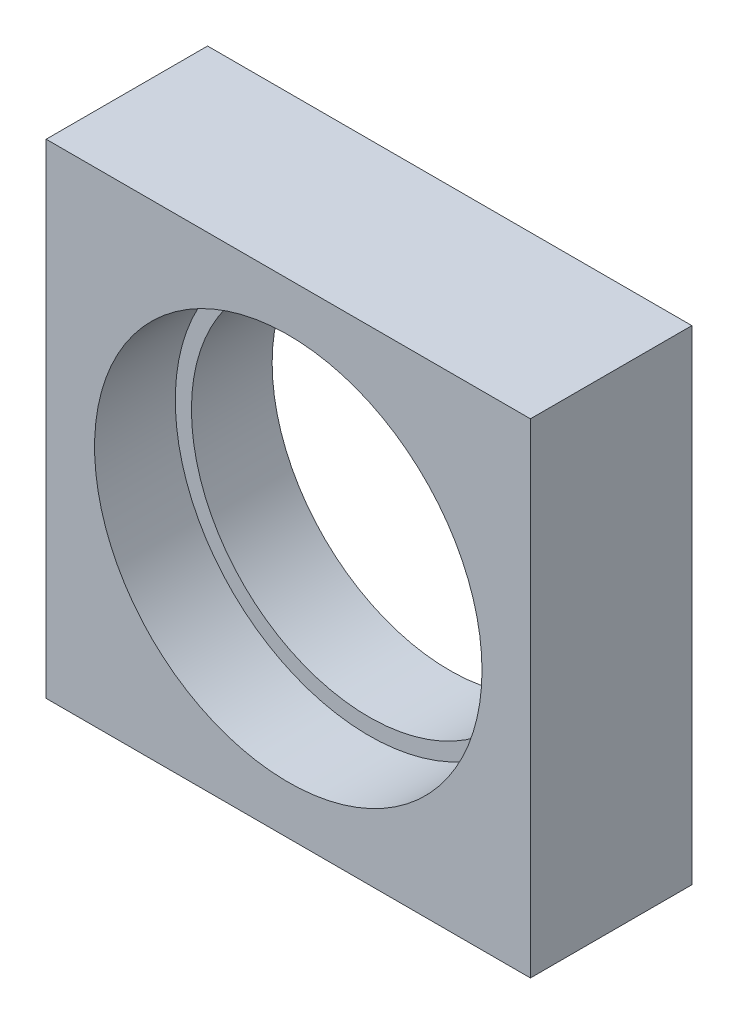
ISO-10303-21;
HEADER;
FILE_DESCRIPTION(('STEP AP214'),'2;1');
FILE_NAME('part.step','',(''),(''),'','','');
FILE_SCHEMA(('AUTOMOTIVE_DESIGN { 1 0 10303 214 1 1 1 1 }'));
ENDSEC;
DATA;
#1=APPLICATION_CONTEXT('core data for automotive mechanical design processes');
#2=APPLICATION_PROTOCOL_DEFINITION('international standard','automotive_design',2000,#1);
#3=PRODUCT_CONTEXT('',#1,'mechanical');
#4=PRODUCT('Part','Part','',(#3));
#5=PRODUCT_RELATED_PRODUCT_CATEGORY('part','',(#4));
#6=PRODUCT_DEFINITION_FORMATION('','',#4);
#7=PRODUCT_DEFINITION_CONTEXT('part definition',#1,'design');
#8=PRODUCT_DEFINITION('design','',#6,#7);
#9=PRODUCT_DEFINITION_SHAPE('','',#8);
#10=(LENGTH_UNIT() NAMED_UNIT(*) SI_UNIT(.MILLI.,.METRE.));
#11=(NAMED_UNIT(*) PLANE_ANGLE_UNIT() SI_UNIT($,.RADIAN.));
#12=(NAMED_UNIT(*) SI_UNIT($,.STERADIAN.) SOLID_ANGLE_UNIT());
#13=UNCERTAINTY_MEASURE_WITH_UNIT(LENGTH_MEASURE(1.E-05),#10,'distance_accuracy_value','');
#14=(GEOMETRIC_REPRESENTATION_CONTEXT(3) GLOBAL_UNCERTAINTY_ASSIGNED_CONTEXT((#13)) GLOBAL_UNIT_ASSIGNED_CONTEXT((#10,
#11,#12)) REPRESENTATION_CONTEXT('',''));
#15=CARTESIAN_POINT('',(0.,0.,0.));
#16=DIRECTION('',(0.,0.,1.));
#17=DIRECTION('',(1.,0.,0.));
#18=AXIS2_PLACEMENT_3D('',#15,#16,#17);
#19=CARTESIAN_POINT('',(-8.03689124095508,36.1836054830851,-30.426406871193));
#20=DIRECTION('',(-1.,0.,0.));
#21=DIRECTION('',(0.,-1.,0.));
#22=AXIS2_PLACEMENT_3D('',#19,#20,#21);
#23=PLANE('',#22);
#24=DIRECTION('',(0.,1.,0.));
#25=VECTOR('',#24,1.);
#26=CARTESIAN_POINT('',(-8.03689124095508,36.1836054830851,11.9999999999999));
#27=LINE('',#26,#25);
#28=CARTESIAN_POINT('',(-8.03689124095507,6.18360548308507,11.9999999999999));
#29=VERTEX_POINT('',#28);
#30=CARTESIAN_POINT('',(-8.03689124095508,36.1836054830851,11.9999999999999));
#31=VERTEX_POINT('',#30);
#32=EDGE_CURVE('E50',#29,#31,#27,.T.);
#33=ORIENTED_EDGE('',*,*,#32,.F.);
#34=DIRECTION('',(0.,0.,1.));
#35=VECTOR('',#34,1.);
#36=CARTESIAN_POINT('',(-8.03689124095507,6.18360548308507,-30.426406871193));
#37=LINE('',#36,#35);
#38=CARTESIAN_POINT('',(-8.03689124095507,6.18360548308507,21.9999999999999));
#39=VERTEX_POINT('',#38);
#40=EDGE_CURVE('E78',#29,#39,#37,.T.);
#41=ORIENTED_EDGE('',*,*,#40,.T.);
#42=DIRECTION('',(0.,-1.,0.));
#43=VECTOR('',#42,1.);
#44=CARTESIAN_POINT('',(-8.03689124095508,36.1836054830851,21.9999999999999));
#45=LINE('',#44,#43);
#46=CARTESIAN_POINT('',(-8.03689124095508,36.1836054830851,21.9999999999999));
#47=VERTEX_POINT('',#46);
#48=EDGE_CURVE('E82',#47,#39,#45,.T.);
#49=ORIENTED_EDGE('',*,*,#48,.F.);
#50=DIRECTION('',(0.,0.,1.));
#51=VECTOR('',#50,1.);
#52=CARTESIAN_POINT('',(-8.03689124095508,36.1836054830851,-30.426406871193));
#53=LINE('',#52,#51);
#54=EDGE_CURVE('E115',#31,#47,#53,.T.);
#55=ORIENTED_EDGE('',*,*,#54,.F.);
#56=EDGE_LOOP('',(#33,#41,#49,#55));
#57=FACE_BOUND('',#56,.T.);
#58=ADVANCED_FACE('F41',(#57),#23,.T.);
#59=CARTESIAN_POINT('',(-8.03689124095508,36.1836054830851,-30.426406871193));
#60=DIRECTION('',(0.,1.,0.));
#61=DIRECTION('',(0.,0.,1.));
#62=AXIS2_PLACEMENT_3D('',#59,#60,#61);
#63=PLANE('',#62);
#64=DIRECTION('',(1.,0.,0.));
#65=VECTOR('',#64,1.);
#66=CARTESIAN_POINT('',(-8.03689124095508,36.1836054830851,11.9999999999999));
#67=LINE('',#66,#65);
#68=CARTESIAN_POINT('',(21.9631087590449,36.1836054830851,11.9999999999999));
#69=VERTEX_POINT('',#68);
#70=EDGE_CURVE('E56',#31,#69,#67,.T.);
#71=ORIENTED_EDGE('',*,*,#70,.F.);
#72=ORIENTED_EDGE('',*,*,#54,.T.);
#73=DIRECTION('',(-1.,0.,0.));
#74=VECTOR('',#73,1.);
#75=CARTESIAN_POINT('',(-8.03689124095508,36.1836054830851,21.9999999999999));
#76=LINE('',#75,#74);
#77=CARTESIAN_POINT('',(21.9631087590449,36.1836054830851,21.9999999999999));
#78=VERTEX_POINT('',#77);
#79=EDGE_CURVE('E88',#78,#47,#76,.T.);
#80=ORIENTED_EDGE('',*,*,#79,.F.);
#81=DIRECTION('',(0.,0.,1.));
#82=VECTOR('',#81,1.);
#83=CARTESIAN_POINT('',(21.9631087590449,36.1836054830851,-30.426406871193));
#84=LINE('',#83,#82);
#85=EDGE_CURVE('E119',#69,#78,#84,.T.);
#86=ORIENTED_EDGE('',*,*,#85,.F.);
#87=EDGE_LOOP('',(#71,#72,#80,#86));
#88=FACE_BOUND('',#87,.T.);
#89=ADVANCED_FACE('F130',(#88),#63,.T.);
#90=CARTESIAN_POINT('',(21.9631087590449,36.1836054830851,-30.426406871193));
#91=DIRECTION('',(1.,0.,0.));
#92=DIRECTION('',(0.,1.,0.));
#93=AXIS2_PLACEMENT_3D('',#90,#91,#92);
#94=PLANE('',#93);
#95=DIRECTION('',(0.,-1.,0.));
#96=VECTOR('',#95,1.);
#97=CARTESIAN_POINT('',(21.9631087590449,36.1836054830851,11.9999999999999));
#98=LINE('',#97,#96);
#99=CARTESIAN_POINT('',(21.9631087590449,6.18360548308506,11.9999999999999));
#100=VERTEX_POINT('',#99);
#101=EDGE_CURVE('E118',#69,#100,#98,.T.);
#102=ORIENTED_EDGE('',*,*,#101,.F.);
#103=ORIENTED_EDGE('',*,*,#85,.T.);
#104=DIRECTION('',(0.,1.,0.));
#105=VECTOR('',#104,1.);
#106=CARTESIAN_POINT('',(21.9631087590449,36.1836054830851,21.9999999999999));
#107=LINE('',#106,#105);
#108=CARTESIAN_POINT('',(21.9631087590449,6.18360548308506,21.9999999999999));
#109=VERTEX_POINT('',#108);
#110=EDGE_CURVE('E97',#109,#78,#107,.T.);
#111=ORIENTED_EDGE('',*,*,#110,.F.);
#112=DIRECTION('',(0.,0.,1.));
#113=VECTOR('',#112,1.);
#114=CARTESIAN_POINT('',(21.9631087590449,6.18360548308506,-30.426406871193));
#115=LINE('',#114,#113);
#116=EDGE_CURVE('E87',#100,#109,#115,.T.);
#117=ORIENTED_EDGE('',*,*,#116,.F.);
#118=EDGE_LOOP('',(#102,#103,#111,#117));
#119=FACE_BOUND('',#118,.T.);
#120=ADVANCED_FACE('F132',(#119),#94,.T.);
#121=CARTESIAN_POINT('',(-8.03689124095507,6.18360548308507,-30.426406871193));
#122=DIRECTION('',(0.,-1.,0.));
#123=DIRECTION('',(1.,0.,0.));
#124=AXIS2_PLACEMENT_3D('',#121,#122,#123);
#125=PLANE('',#124);
#126=DIRECTION('',(-1.,0.,0.));
#127=VECTOR('',#126,1.);
#128=CARTESIAN_POINT('',(-8.03689124095507,6.18360548308507,11.9999999999999));
#129=LINE('',#128,#127);
#130=EDGE_CURVE('E11',#100,#29,#129,.T.);
#131=ORIENTED_EDGE('',*,*,#130,.F.);
#132=ORIENTED_EDGE('',*,*,#116,.T.);
#133=DIRECTION('',(1.,0.,0.));
#134=VECTOR('',#133,1.);
#135=CARTESIAN_POINT('',(-8.03689124095507,6.18360548308507,21.9999999999999));
#136=LINE('',#135,#134);
#137=EDGE_CURVE('E90',#39,#109,#136,.T.);
#138=ORIENTED_EDGE('',*,*,#137,.F.);
#139=ORIENTED_EDGE('',*,*,#40,.F.);
#140=EDGE_LOOP('',(#131,#132,#138,#139));
#141=FACE_BOUND('',#140,.T.);
#142=ADVANCED_FACE('F91',(#141),#125,.T.);
#143=CARTESIAN_POINT('',(0.,0.,21.9999999999999));
#144=DIRECTION('',(0.,0.,1.));
#145=DIRECTION('',(1.,0.,0.));
#146=AXIS2_PLACEMENT_3D('',#143,#144,#145);
#147=PLANE('',#146);
#148=CARTESIAN_POINT('',(6.96310875904493,21.1836054830851,21.9999999999999));
#149=DIRECTION('',(0.,0.,1.));
#150=DIRECTION('',(1.,0.,0.));
#151=AXIS2_PLACEMENT_3D('',#148,#149,#150);
#152=CIRCLE('',#151,12.);
#153=CARTESIAN_POINT('',(18.9631087590449,21.1836054830851,21.9999999999999));
#154=VERTEX_POINT('',#153);
#155=EDGE_CURVE('E102',#154,#154,#152,.T.);
#156=ORIENTED_EDGE('',*,*,#155,.F.);
#157=EDGE_LOOP('',(#156));
#158=FACE_BOUND('',#157,.T.);
#159=ORIENTED_EDGE('',*,*,#48,.T.);
#160=ORIENTED_EDGE('',*,*,#137,.T.);
#161=ORIENTED_EDGE('',*,*,#110,.T.);
#162=ORIENTED_EDGE('',*,*,#79,.T.);
#163=EDGE_LOOP('',(#159,#160,#161,#162));
#164=FACE_BOUND('',#163,.T.);
#165=ADVANCED_FACE('F99',(#158,#164),#147,.T.);
#166=CARTESIAN_POINT('',(6.96310875904493,21.1836054830851,11.9999999999999));
#167=DIRECTION('',(0.,0.,1.));
#168=DIRECTION('',(1.,0.,0.));
#169=AXIS2_PLACEMENT_3D('',#166,#167,#168);
#170=PLANE('',#169);
#171=CARTESIAN_POINT('',(6.96310875904493,21.1836054830851,11.9999999999999));
#172=DIRECTION('',(0.,0.,1.));
#173=DIRECTION('',(1.,0.,0.));
#174=AXIS2_PLACEMENT_3D('',#171,#172,#173);
#175=CIRCLE('',#174,11.);
#176=CARTESIAN_POINT('',(-4.03689124095507,21.1836054830851,11.9999999999999));
#177=VERTEX_POINT('',#176);
#178=EDGE_CURVE('E106',#177,#177,#175,.T.);
#179=ORIENTED_EDGE('',*,*,#178,.T.);
#180=EDGE_LOOP('',(#179));
#181=FACE_BOUND('',#180,.T.);
#182=ORIENTED_EDGE('',*,*,#32,.T.);
#183=ORIENTED_EDGE('',*,*,#70,.T.);
#184=ORIENTED_EDGE('',*,*,#101,.T.);
#185=ORIENTED_EDGE('',*,*,#130,.T.);
#186=EDGE_LOOP('',(#182,#183,#184,#185));
#187=FACE_BOUND('',#186,.T.);
#188=ADVANCED_FACE('F127',(#181,#187),#170,.F.);
#189=CARTESIAN_POINT('',(6.96310875904493,21.1836054830851,11.9999999999999));
#190=DIRECTION('',(0.,0.,-1.));
#191=DIRECTION('',(-1.,0.,0.));
#192=AXIS2_PLACEMENT_3D('',#189,#190,#191);
#193=CYLINDRICAL_SURFACE('',#192,12.);
#194=CARTESIAN_POINT('',(6.96310875904493,21.1836054830851,16.9999999999998));
#195=DIRECTION('',(0.,0.,1.));
#196=DIRECTION('',(1.,0.,0.));
#197=AXIS2_PLACEMENT_3D('',#194,#195,#196);
#198=CIRCLE('',#197,12.);
#199=CARTESIAN_POINT('',(18.9631087590449,21.1836054830851,16.9999999999998));
#200=VERTEX_POINT('',#199);
#201=EDGE_CURVE('E228',#200,#200,#198,.F.);
#202=ORIENTED_EDGE('',*,*,#201,.T.);
#203=EDGE_LOOP('',(#202));
#204=FACE_BOUND('',#203,.T.);
#205=ORIENTED_EDGE('',*,*,#155,.T.);
#206=EDGE_LOOP('',(#205));
#207=FACE_BOUND('',#206,.T.);
#208=ADVANCED_FACE('F166',(#204,#207),#193,.F.);
#209=CARTESIAN_POINT('',(6.96310875904493,21.1836054830851,55.9411254969541));
#210=DIRECTION('',(0.,0.,-1.));
#211=DIRECTION('',(-1.,0.,0.));
#212=AXIS2_PLACEMENT_3D('',#209,#210,#211);
#213=CYLINDRICAL_SURFACE('',#212,11.);
#214=CARTESIAN_POINT('',(6.96310875904493,21.1836054830851,16.9999999999998));
#215=DIRECTION('',(0.,0.,1.));
#216=DIRECTION('',(1.,0.,0.));
#217=AXIS2_PLACEMENT_3D('',#214,#215,#216);
#218=CIRCLE('',#217,11.);
#219=CARTESIAN_POINT('',(-4.03689124095507,21.1836054830851,16.9999999999998));
#220=VERTEX_POINT('',#219);
#221=EDGE_CURVE('E224',#220,#220,#218,.F.);
#222=CARTESIAN_POINT('',(-4.03689124095507,21.1836054830851,16.9999999999998));
#223=CARTESIAN_POINT('',(-4.03689124095507,21.1836054830851,16.9479166666665));
#224=CARTESIAN_POINT('',(-4.03689124095507,21.1836054830851,16.8958333333332));
#225=CARTESIAN_POINT('',(-4.03689124095507,21.1836054830851,16.7916666666665));
#226=CARTESIAN_POINT('',(-4.03689124095507,21.1836054830851,16.7395833333332));
#227=CARTESIAN_POINT('',(-4.03689124095507,21.1836054830851,16.6354166666665));
#228=CARTESIAN_POINT('',(-4.03689124095507,21.1836054830851,16.5833333333332));
#229=CARTESIAN_POINT('',(-4.03689124095507,21.1836054830851,16.4791666666665));
#230=CARTESIAN_POINT('',(-4.03689124095507,21.1836054830851,16.4270833333332));
#231=CARTESIAN_POINT('',(-4.03689124095507,21.1836054830851,16.3229166666665));
#232=CARTESIAN_POINT('',(-4.03689124095507,21.1836054830851,16.2708333333332));
#233=CARTESIAN_POINT('',(-4.03689124095507,21.1836054830851,16.1666666666665));
#234=CARTESIAN_POINT('',(-4.03689124095507,21.1836054830851,16.1145833333332));
#235=CARTESIAN_POINT('',(-4.03689124095507,21.1836054830851,16.0104166666665));
#236=CARTESIAN_POINT('',(-4.03689124095507,21.1836054830851,15.9583333333332));
#237=CARTESIAN_POINT('',(-4.03689124095507,21.1836054830851,15.8541666666665));
#238=CARTESIAN_POINT('',(-4.03689124095507,21.1836054830851,15.8020833333332));
#239=CARTESIAN_POINT('',(-4.03689124095507,21.1836054830851,15.6979166666665));
#240=CARTESIAN_POINT('',(-4.03689124095507,21.1836054830851,15.6458333333332));
#241=CARTESIAN_POINT('',(-4.03689124095507,21.1836054830851,15.5416666666665));
#242=CARTESIAN_POINT('',(-4.03689124095507,21.1836054830851,15.4895833333332));
#243=CARTESIAN_POINT('',(-4.03689124095507,21.1836054830851,15.3854166666665));
#244=CARTESIAN_POINT('',(-4.03689124095507,21.1836054830851,15.3333333333332));
#245=CARTESIAN_POINT('',(-4.03689124095507,21.1836054830851,15.2291666666665));
#246=CARTESIAN_POINT('',(-4.03689124095507,21.1836054830851,15.1770833333332));
#247=CARTESIAN_POINT('',(-4.03689124095507,21.1836054830851,15.0729166666665));
#248=CARTESIAN_POINT('',(-4.03689124095507,21.1836054830851,15.0208333333332));
#249=CARTESIAN_POINT('',(-4.03689124095507,21.1836054830851,14.9166666666665));
#250=CARTESIAN_POINT('',(-4.03689124095507,21.1836054830851,14.8645833333332));
#251=CARTESIAN_POINT('',(-4.03689124095507,21.1836054830851,14.7604166666665));
#252=CARTESIAN_POINT('',(-4.03689124095507,21.1836054830851,14.7083333333332));
#253=CARTESIAN_POINT('',(-4.03689124095507,21.1836054830851,14.6041666666665));
#254=CARTESIAN_POINT('',(-4.03689124095507,21.1836054830851,14.5520833333332));
#255=CARTESIAN_POINT('',(-4.03689124095507,21.1836054830851,14.4479166666665));
#256=CARTESIAN_POINT('',(-4.03689124095507,21.1836054830851,14.3958333333332));
#257=CARTESIAN_POINT('',(-4.03689124095507,21.1836054830851,14.2916666666665));
#258=CARTESIAN_POINT('',(-4.03689124095507,21.1836054830851,14.2395833333332));
#259=CARTESIAN_POINT('',(-4.03689124095507,21.1836054830851,14.1354166666665));
#260=CARTESIAN_POINT('',(-4.03689124095507,21.1836054830851,14.0833333333332));
#261=CARTESIAN_POINT('',(-4.03689124095507,21.1836054830851,13.9791666666665));
#262=CARTESIAN_POINT('',(-4.03689124095507,21.1836054830851,13.9270833333332));
#263=CARTESIAN_POINT('',(-4.03689124095507,21.1836054830851,13.8229166666665));
#264=CARTESIAN_POINT('',(-4.03689124095507,21.1836054830851,13.7708333333332));
#265=CARTESIAN_POINT('',(-4.03689124095507,21.1836054830851,13.6666666666665));
#266=CARTESIAN_POINT('',(-4.03689124095507,21.1836054830851,13.6145833333332));
#267=CARTESIAN_POINT('',(-4.03689124095507,21.1836054830851,13.5104166666665));
#268=CARTESIAN_POINT('',(-4.03689124095507,21.1836054830851,13.4583333333332));
#269=CARTESIAN_POINT('',(-4.03689124095507,21.1836054830851,13.3541666666665));
#270=CARTESIAN_POINT('',(-4.03689124095507,21.1836054830851,13.3020833333332));
#271=CARTESIAN_POINT('',(-4.03689124095507,21.1836054830851,13.1979166666665));
#272=CARTESIAN_POINT('',(-4.03689124095507,21.1836054830851,13.1458333333332));
#273=CARTESIAN_POINT('',(-4.03689124095507,21.1836054830851,13.0416666666665));
#274=CARTESIAN_POINT('',(-4.03689124095507,21.1836054830851,12.9895833333332));
#275=CARTESIAN_POINT('',(-4.03689124095507,21.1836054830851,12.8854166666665));
#276=CARTESIAN_POINT('',(-4.03689124095507,21.1836054830851,12.8333333333332));
#277=CARTESIAN_POINT('',(-4.03689124095507,21.1836054830851,12.7291666666665));
#278=CARTESIAN_POINT('',(-4.03689124095507,21.1836054830851,12.6770833333332));
#279=CARTESIAN_POINT('',(-4.03689124095507,21.1836054830851,12.5729166666665));
#280=CARTESIAN_POINT('',(-4.03689124095507,21.1836054830851,12.5208333333332));
#281=CARTESIAN_POINT('',(-4.03689124095507,21.1836054830851,12.4166666666665));
#282=CARTESIAN_POINT('',(-4.03689124095507,21.1836054830851,12.3645833333332));
#283=CARTESIAN_POINT('',(-4.03689124095507,21.1836054830851,12.2604166666665));
#284=CARTESIAN_POINT('',(-4.03689124095507,21.1836054830851,12.2083333333332));
#285=CARTESIAN_POINT('',(-4.03689124095507,21.1836054830851,12.1041666666665));
#286=CARTESIAN_POINT('',(-4.03689124095507,21.1836054830851,12.0520833333332));
#287=CARTESIAN_POINT('',(-4.03689124095507,21.1836054830851,11.9999999999999));
#288=B_SPLINE_CURVE_WITH_KNOTS('',3,(#222,#223,#224,#225,#226,#227,#228,#229,#230,#231,#232,
#233,#234,#235,#236,#237,#238,#239,#240,#241,#242,#243,#244,#245,#246,#247,#248,#249,#250,#251,
#252,#253,#254,#255,#256,#257,#258,#259,#260,#261,#262,#263,#264,#265,#266,#267,#268,#269,#270,
#271,#272,#273,#274,#275,#276,#277,#278,#279,#280,#281,#282,#283,#284,#285,#286,#287),
.UNSPECIFIED.,.F.,.F.,(4,2,2,2,2,2,2,2,2,2,2,2,2,2,2,2,2,2,2,2,2,2,2,2,2,2,2,2,2,2,2,2,4),(0.,
0.156249999999997,0.3125,0.468749999999997,0.625000000000001,0.781249999999997,
0.937500000000001,1.09375,1.25,1.40625,1.56249999999999,1.71875,1.87499999999999,2.03125,2.1875,
2.34375,2.5,2.65624999999999,2.8125,2.96874999999999,3.125,3.28124999999999,3.4375,
3.59374999999999,3.74999999999999,3.90624999999999,4.06249999999999,4.21874999999999,
4.37499999999999,4.53124999999999,4.68749999999999,4.84374999999999,4.99999999999999),.UNSPECIFIED.);
#289=EDGE_CURVE('BSEAM171',#220,#177,#288,.T.);
#290=ORIENTED_EDGE('',*,*,#221,.F.);
#291=ORIENTED_EDGE('',*,*,#178,.F.);
#292=ORIENTED_EDGE('',*,*,#289,.T.);
#293=ORIENTED_EDGE('',*,*,#289,.F.);
#294=EDGE_LOOP('',(#290,#292,#291,#293));
#295=FACE_BOUND('',#294,.T.);
#296=ADVANCED_FACE('F171',(#295),#213,.F.);
#297=CARTESIAN_POINT('',(6.96310875904493,21.1836054830851,16.9999999999999));
#298=DIRECTION('',(0.,0.,1.));
#299=DIRECTION('',(1.,0.,0.));
#300=AXIS2_PLACEMENT_3D('',#297,#298,#299);
#301=PLANE('',#300);
#302=ORIENTED_EDGE('',*,*,#201,.F.);
#303=EDGE_LOOP('',(#302));
#304=FACE_BOUND('',#303,.T.);
#305=ORIENTED_EDGE('',*,*,#221,.T.);
#306=EDGE_LOOP('',(#305));
#307=FACE_BOUND('',#306,.T.);
#308=ADVANCED_FACE('F186',(#304,#307),#301,.T.);
#309=CLOSED_SHELL('',(#58,#89,#120,#142,#165,#188,#208,#296,#308));
#310=MANIFOLD_SOLID_BREP('B2',#309);
#311=ADVANCED_BREP_SHAPE_REPRESENTATION('',(#18,#310),#14);
#312=SHAPE_DEFINITION_REPRESENTATION(#9,#311);
ENDSEC;
END-ISO-10303-21;
